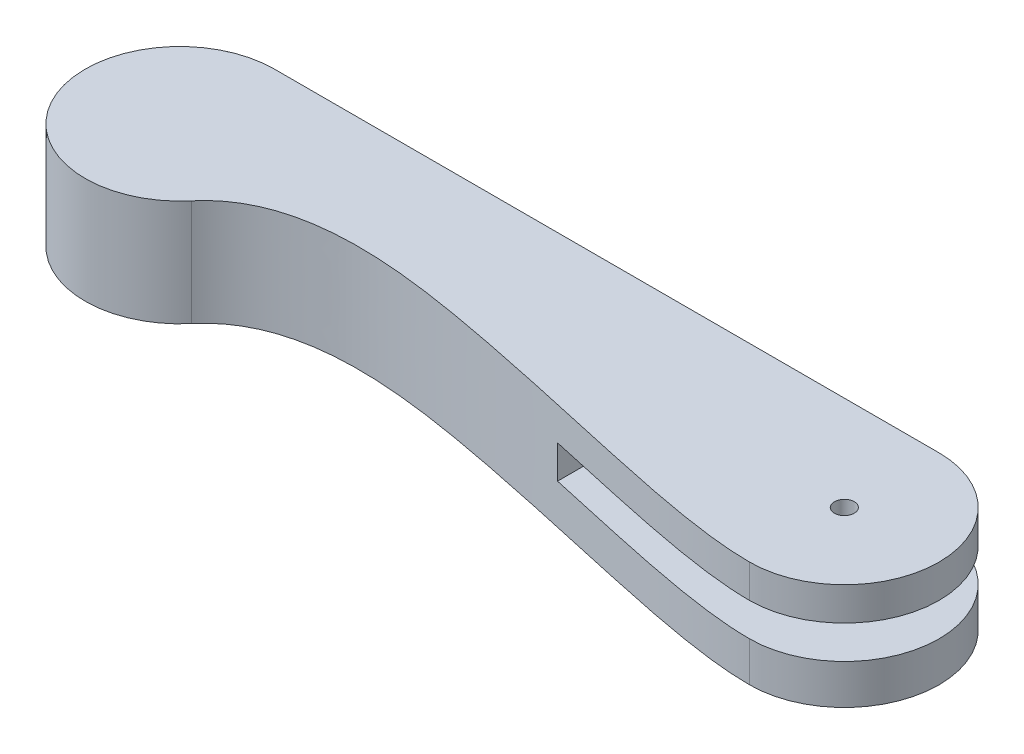
ISO-10303-21;
HEADER;
FILE_DESCRIPTION(('STEP AP214'),'2;1');
FILE_NAME('part.step','',(''),(''),'','','');
FILE_SCHEMA(('AUTOMOTIVE_DESIGN { 1 0 10303 214 1 1 1 1 }'));
ENDSEC;
DATA;
#1=APPLICATION_CONTEXT('core data for automotive mechanical design processes');
#2=APPLICATION_PROTOCOL_DEFINITION('international standard','automotive_design',2000,#1);
#3=PRODUCT_CONTEXT('',#1,'mechanical');
#4=PRODUCT('Part','Part','',(#3));
#5=PRODUCT_RELATED_PRODUCT_CATEGORY('part','',(#4));
#6=PRODUCT_DEFINITION_FORMATION('','',#4);
#7=PRODUCT_DEFINITION_CONTEXT('part definition',#1,'design');
#8=PRODUCT_DEFINITION('design','',#6,#7);
#9=PRODUCT_DEFINITION_SHAPE('','',#8);
#10=(LENGTH_UNIT() NAMED_UNIT(*) SI_UNIT(.MILLI.,.METRE.));
#11=(NAMED_UNIT(*) PLANE_ANGLE_UNIT() SI_UNIT($,.RADIAN.));
#12=(NAMED_UNIT(*) SI_UNIT($,.STERADIAN.) SOLID_ANGLE_UNIT());
#13=UNCERTAINTY_MEASURE_WITH_UNIT(LENGTH_MEASURE(1.E-05),#10,'distance_accuracy_value','');
#14=(GEOMETRIC_REPRESENTATION_CONTEXT(3) GLOBAL_UNCERTAINTY_ASSIGNED_CONTEXT((#13)) GLOBAL_UNIT_ASSIGNED_CONTEXT((#10,
#11,#12)) REPRESENTATION_CONTEXT('',''));
#15=CARTESIAN_POINT('',(0.,0.,0.));
#16=DIRECTION('',(0.,0.,1.));
#17=DIRECTION('',(1.,0.,0.));
#18=AXIS2_PLACEMENT_3D('',#15,#16,#17);
#19=CARTESIAN_POINT('',(-50.,6.,0.));
#20=DIRECTION('',(0.,1.,0.));
#21=DIRECTION('',(0.,0.,1.));
#22=AXIS2_PLACEMENT_3D('',#19,#20,#21);
#23=PLANE('',#22);
#24=CARTESIAN_POINT('',(50.,6.,0.));
#25=DIRECTION('',(0.,-1.,0.));
#26=DIRECTION('',(0.,0.,-1.));
#27=AXIS2_PLACEMENT_3D('',#24,#25,#26);
#28=CIRCLE('',#27,1.5);
#29=CARTESIAN_POINT('',(50.,6.,-1.50000000000002));
#30=VERTEX_POINT('',#29);
#31=EDGE_CURVE('E185',#30,#30,#28,.T.);
#32=ORIENTED_EDGE('',*,*,#31,.T.);
#33=EDGE_LOOP('',(#32));
#34=FACE_BOUND('',#33,.T.);
#35=DIRECTION('',(0.,0.,-1.));
#36=VECTOR('',#35,1.);
#37=CARTESIAN_POINT('',(15.,6.,-14.25));
#38=LINE('',#37,#36);
#39=CARTESIAN_POINT('',(15.,6.,8.15498555520888));
#40=VERTEX_POINT('',#39);
#41=CARTESIAN_POINT('',(15.,6.,-14.25));
#42=VERTEX_POINT('',#41);
#43=EDGE_CURVE('E86',#40,#42,#38,.T.);
#44=ORIENTED_EDGE('',*,*,#43,.F.);
#45=CARTESIAN_POINT('',(-39.0731568300049,6.,9.1469447543063));
#46=CARTESIAN_POINT('',(-31.5140940330976,6.,0.116968525897957));
#47=CARTESIAN_POINT('',(5.43865583696203,6.,4.64524054337758));
#48=CARTESIAN_POINT('',(38.6975143870055,6.,14.25));
#49=CARTESIAN_POINT('',(50.,6.,14.25));
#50=B_SPLINE_CURVE_WITH_KNOTS('',3,(#45,#46,#47,#48,#49),.UNSPECIFIED.,.F.,.F.,(4,1,4),(0.,
0.43590790251524,1.),.UNSPECIFIED.);
#51=CARTESIAN_POINT('',(50.,6.,14.25));
#52=VERTEX_POINT('',#51);
#53=EDGE_CURVE('E206',#52,#40,#50,.F.);
#54=ORIENTED_EDGE('',*,*,#53,.F.);
#55=CARTESIAN_POINT('',(50.,6.,0.));
#56=DIRECTION('',(0.,1.,0.));
#57=DIRECTION('',(0.,0.,1.));
#58=AXIS2_PLACEMENT_3D('',#55,#56,#57);
#59=CIRCLE('',#58,14.25);
#60=CARTESIAN_POINT('',(50.,6.,-14.25));
#61=VERTEX_POINT('',#60);
#62=EDGE_CURVE('E67',#52,#61,#59,.T.);
#63=ORIENTED_EDGE('',*,*,#62,.T.);
#64=DIRECTION('',(-1.,0.,0.));
#65=VECTOR('',#64,1.);
#66=CARTESIAN_POINT('',(-50.,6.,-14.25));
#67=LINE('',#66,#65);
#68=EDGE_CURVE('E148',#61,#42,#67,.T.);
#69=ORIENTED_EDGE('',*,*,#68,.T.);
#70=EDGE_LOOP('',(#44,#54,#63,#69));
#71=FACE_BOUND('',#70,.T.);
#72=ADVANCED_FACE('F41',(#34,#71),#23,.T.);
#73=CARTESIAN_POINT('',(-50.,0.,0.));
#74=DIRECTION('',(0.,1.,0.));
#75=DIRECTION('',(0.,0.,1.));
#76=AXIS2_PLACEMENT_3D('',#73,#74,#75);
#77=PLANE('',#76);
#78=CARTESIAN_POINT('',(-50.,0.,8.25));
#79=DIRECTION('',(0.,1.,0.));
#80=DIRECTION('',(0.,0.,1.));
#81=AXIS2_PLACEMENT_3D('',#78,#79,#80);
#82=CIRCLE('',#81,2.49999999999999);
#83=CARTESIAN_POINT('',(-50.,0.,10.75));
#84=VERTEX_POINT('',#83);
#85=EDGE_CURVE('E188',#84,#84,#82,.F.);
#86=ORIENTED_EDGE('',*,*,#85,.F.);
#87=EDGE_LOOP('',(#86));
#88=FACE_BOUND('',#87,.T.);
#89=CARTESIAN_POINT('',(-49.9999999999999,0.,-8.25));
#90=DIRECTION('',(0.,1.,0.));
#91=DIRECTION('',(0.,0.,1.));
#92=AXIS2_PLACEMENT_3D('',#89,#90,#91);
#93=CIRCLE('',#92,2.49999999999999);
#94=CARTESIAN_POINT('',(-49.9999999999999,0.,-5.75000000000001));
#95=VERTEX_POINT('',#94);
#96=EDGE_CURVE('E141',#95,#95,#93,.F.);
#97=ORIENTED_EDGE('',*,*,#96,.F.);
#98=EDGE_LOOP('',(#97));
#99=FACE_BOUND('',#98,.T.);
#100=CARTESIAN_POINT('',(50.,0.,0.));
#101=DIRECTION('',(0.,-1.,0.));
#102=DIRECTION('',(0.,0.,-1.));
#103=AXIS2_PLACEMENT_3D('',#100,#101,#102);
#104=CIRCLE('',#103,1.5);
#105=CARTESIAN_POINT('',(50.,0.,-1.50000000000002));
#106=VERTEX_POINT('',#105);
#107=EDGE_CURVE('E189',#106,#106,#104,.T.);
#108=ORIENTED_EDGE('',*,*,#107,.F.);
#109=EDGE_LOOP('',(#108));
#110=FACE_BOUND('',#109,.T.);
#111=CARTESIAN_POINT('',(-39.0731568300049,0.,9.1469447543063));
#112=CARTESIAN_POINT('',(-31.5140940330976,0.,0.116968525897957));
#113=CARTESIAN_POINT('',(5.43865583696203,0.,4.64524054337758));
#114=CARTESIAN_POINT('',(38.6975143870055,0.,14.25));
#115=CARTESIAN_POINT('',(50.,0.,14.25));
#116=B_SPLINE_CURVE_WITH_KNOTS('',3,(#111,#112,#113,#114,#115),.UNSPECIFIED.,.F.,.F.,(4,1,4),
(0.,0.43590790251524,1.),.UNSPECIFIED.);
#117=CARTESIAN_POINT('',(50.,0.,14.25));
#118=VERTEX_POINT('',#117);
#119=CARTESIAN_POINT('',(-39.0731568300049,0.,9.14694475430629));
#120=VERTEX_POINT('',#119);
#121=EDGE_CURVE('E126',#118,#120,#116,.F.);
#122=ORIENTED_EDGE('',*,*,#121,.T.);
#123=CARTESIAN_POINT('',(-50.,0.,0.));
#124=DIRECTION('',(0.,1.,0.));
#125=DIRECTION('',(0.,0.,1.));
#126=AXIS2_PLACEMENT_3D('',#123,#124,#125);
#127=CIRCLE('',#126,14.25);
#128=CARTESIAN_POINT('',(-50.,0.,-14.25));
#129=VERTEX_POINT('',#128);
#130=EDGE_CURVE('E138',#129,#120,#127,.T.);
#131=ORIENTED_EDGE('',*,*,#130,.F.);
#132=DIRECTION('',(-1.,0.,0.));
#133=VECTOR('',#132,1.);
#134=CARTESIAN_POINT('',(-50.,0.,-14.25));
#135=LINE('',#134,#133);
#136=CARTESIAN_POINT('',(50.,0.,-14.25));
#137=VERTEX_POINT('',#136);
#138=EDGE_CURVE('E137',#137,#129,#135,.T.);
#139=ORIENTED_EDGE('',*,*,#138,.F.);
#140=CARTESIAN_POINT('',(50.,0.,0.));
#141=DIRECTION('',(0.,1.,0.));
#142=DIRECTION('',(0.,0.,1.));
#143=AXIS2_PLACEMENT_3D('',#140,#141,#142);
#144=CIRCLE('',#143,14.25);
#145=EDGE_CURVE('E78',#118,#137,#144,.T.);
#146=ORIENTED_EDGE('',*,*,#145,.F.);
#147=EDGE_LOOP('',(#122,#131,#139,#146));
#148=FACE_BOUND('',#147,.T.);
#149=ADVANCED_FACE('F136',(#88,#99,#110,#148),#77,.F.);
#150=CARTESIAN_POINT('',(15.,11.,-14.25));
#151=DIRECTION('',(-1.,0.,0.));
#152=DIRECTION('',(0.,0.,1.));
#153=AXIS2_PLACEMENT_3D('',#150,#151,#152);
#154=PLANE('',#153);
#155=DIRECTION('',(0.,1.,0.));
#156=VECTOR('',#155,1.);
#157=CARTESIAN_POINT('',(15.,-0.001000000000001,8.15498555520888));
#158=LINE('',#157,#156);
#159=CARTESIAN_POINT('',(15.0000000058143,11.,8.1549855564899));
#160=VERTEX_POINT('',#159);
#161=EDGE_CURVE('E205',#160,#40,#158,.F.);
#162=ORIENTED_EDGE('',*,*,#161,.T.);
#163=ORIENTED_EDGE('',*,*,#43,.T.);
#164=DIRECTION('',(0.,-1.,0.));
#165=VECTOR('',#164,1.);
#166=CARTESIAN_POINT('',(15.,11.,-14.25));
#167=LINE('',#166,#165);
#168=CARTESIAN_POINT('',(15.,11.,-14.25));
#169=VERTEX_POINT('',#168);
#170=EDGE_CURVE('E180',#169,#42,#167,.T.);
#171=ORIENTED_EDGE('',*,*,#170,.F.);
#172=DIRECTION('',(0.,0.,-1.));
#173=VECTOR('',#172,1.);
#174=CARTESIAN_POINT('',(15.,11.,-14.25));
#175=LINE('',#174,#173);
#176=EDGE_CURVE('E93',#160,#169,#175,.T.);
#177=ORIENTED_EDGE('',*,*,#176,.F.);
#178=EDGE_LOOP('',(#162,#163,#171,#177));
#179=FACE_BOUND('',#178,.T.);
#180=ADVANCED_FACE('F204',(#179),#154,.F.);
#181=CARTESIAN_POINT('',(-50.,11.,0.));
#182=DIRECTION('',(0.,1.,0.));
#183=DIRECTION('',(0.,0.,1.));
#184=AXIS2_PLACEMENT_3D('',#181,#182,#183);
#185=PLANE('',#184);
#186=CARTESIAN_POINT('',(50.,11.,0.));
#187=DIRECTION('',(0.,1.,0.));
#188=DIRECTION('',(0.,0.,1.));
#189=AXIS2_PLACEMENT_3D('',#186,#187,#188);
#190=CIRCLE('',#189,1.5);
#191=CARTESIAN_POINT('',(50.,11.,1.49999999999999));
#192=VERTEX_POINT('',#191);
#193=EDGE_CURVE('E157',#192,#192,#190,.F.);
#194=ORIENTED_EDGE('',*,*,#193,.F.);
#195=EDGE_LOOP('',(#194));
#196=FACE_BOUND('',#195,.T.);
#197=CARTESIAN_POINT('',(-39.0731568300049,11.,9.1469447543063));
#198=CARTESIAN_POINT('',(-31.5140940330976,11.,0.116968525897957));
#199=CARTESIAN_POINT('',(5.43865583696203,11.,4.64524054337758));
#200=CARTESIAN_POINT('',(38.6975143870055,11.,14.25));
#201=CARTESIAN_POINT('',(50.,11.,14.25));
#202=B_SPLINE_CURVE_WITH_KNOTS('',3,(#197,#198,#199,#200,#201),.UNSPECIFIED.,.F.,.F.,(4,1,4),
(0.,0.43590790251524,1.),.UNSPECIFIED.);
#203=CARTESIAN_POINT('',(50.,11.,14.25));
#204=VERTEX_POINT('',#203);
#205=EDGE_CURVE('E132',#204,#160,#202,.F.);
#206=ORIENTED_EDGE('',*,*,#205,.T.);
#207=ORIENTED_EDGE('',*,*,#176,.T.);
#208=DIRECTION('',(-1.,0.,0.));
#209=VECTOR('',#208,1.);
#210=CARTESIAN_POINT('',(-50.,11.,-14.25));
#211=LINE('',#210,#209);
#212=CARTESIAN_POINT('',(50.,11.,-14.25));
#213=VERTEX_POINT('',#212);
#214=EDGE_CURVE('E156',#213,#169,#211,.T.);
#215=ORIENTED_EDGE('',*,*,#214,.F.);
#216=CARTESIAN_POINT('',(50.,11.,0.));
#217=DIRECTION('',(0.,1.,0.));
#218=DIRECTION('',(0.,0.,1.));
#219=AXIS2_PLACEMENT_3D('',#216,#217,#218);
#220=CIRCLE('',#219,14.25);
#221=EDGE_CURVE('E155',#204,#213,#220,.T.);
#222=ORIENTED_EDGE('',*,*,#221,.F.);
#223=EDGE_LOOP('',(#206,#207,#215,#222));
#224=FACE_BOUND('',#223,.T.);
#225=ADVANCED_FACE('F241',(#196,#224),#185,.F.);
#226=CARTESIAN_POINT('',(-50.,16.,0.));
#227=DIRECTION('',(0.,1.,0.));
#228=DIRECTION('',(0.,0.,1.));
#229=AXIS2_PLACEMENT_3D('',#226,#227,#228);
#230=PLANE('',#229);
#231=CARTESIAN_POINT('',(50.,16.,0.));
#232=DIRECTION('',(0.,1.,0.));
#233=DIRECTION('',(0.,0.,1.));
#234=AXIS2_PLACEMENT_3D('',#231,#232,#233);
#235=CIRCLE('',#234,1.5);
#236=CARTESIAN_POINT('',(50.,16.,1.49999999999999));
#237=VERTEX_POINT('',#236);
#238=EDGE_CURVE('E165',#237,#237,#235,.T.);
#239=ORIENTED_EDGE('',*,*,#238,.F.);
#240=EDGE_LOOP('',(#239));
#241=FACE_BOUND('',#240,.T.);
#242=CARTESIAN_POINT('',(-50.,16.,0.));
#243=DIRECTION('',(0.,1.,0.));
#244=DIRECTION('',(0.,0.,1.));
#245=AXIS2_PLACEMENT_3D('',#242,#243,#244);
#246=CIRCLE('',#245,14.25);
#247=CARTESIAN_POINT('',(-50.,16.,-14.25));
#248=VERTEX_POINT('',#247);
#249=CARTESIAN_POINT('',(-39.0731568300049,16.,9.14694475430629));
#250=VERTEX_POINT('',#249);
#251=EDGE_CURVE('E58',#248,#250,#246,.T.);
#252=ORIENTED_EDGE('',*,*,#251,.T.);
#253=CARTESIAN_POINT('',(-39.0731568300049,16.,9.1469447543063));
#254=CARTESIAN_POINT('',(-31.5140940330976,16.,0.116968525897957));
#255=CARTESIAN_POINT('',(5.43865583696203,16.,4.64524054337758));
#256=CARTESIAN_POINT('',(38.6975143870055,16.,14.25));
#257=CARTESIAN_POINT('',(50.,16.,14.25));
#258=B_SPLINE_CURVE_WITH_KNOTS('',3,(#253,#254,#255,#256,#257),.UNSPECIFIED.,.F.,.F.,(4,1,4),
(0.,0.43590790251524,1.),.UNSPECIFIED.);
#259=CARTESIAN_POINT('',(50.,16.,14.25));
#260=VERTEX_POINT('',#259);
#261=EDGE_CURVE('E208',#250,#260,#258,.T.);
#262=ORIENTED_EDGE('',*,*,#261,.T.);
#263=CARTESIAN_POINT('',(50.,16.,0.));
#264=DIRECTION('',(0.,1.,0.));
#265=DIRECTION('',(0.,0.,1.));
#266=AXIS2_PLACEMENT_3D('',#263,#264,#265);
#267=CIRCLE('',#266,14.25);
#268=CARTESIAN_POINT('',(50.,16.,-14.25));
#269=VERTEX_POINT('',#268);
#270=EDGE_CURVE('E174',#260,#269,#267,.T.);
#271=ORIENTED_EDGE('',*,*,#270,.T.);
#272=DIRECTION('',(-1.,0.,0.));
#273=VECTOR('',#272,1.);
#274=CARTESIAN_POINT('',(-50.,16.,-14.25));
#275=LINE('',#274,#273);
#276=EDGE_CURVE('E176',#269,#248,#275,.T.);
#277=ORIENTED_EDGE('',*,*,#276,.T.);
#278=EDGE_LOOP('',(#252,#262,#271,#277));
#279=FACE_BOUND('',#278,.T.);
#280=ADVANCED_FACE('F238',(#241,#279),#230,.T.);
#281=CARTESIAN_POINT('',(-50.,6.,0.));
#282=DIRECTION('',(0.,-1.,0.));
#283=DIRECTION('',(0.,0.,-1.));
#284=AXIS2_PLACEMENT_3D('',#281,#282,#283);
#285=CYLINDRICAL_SURFACE('',#284,14.25);
#286=ORIENTED_EDGE('',*,*,#130,.T.);
#287=DIRECTION('',(0.,1.,0.));
#288=VECTOR('',#287,1.);
#289=CARTESIAN_POINT('',(-39.0731568300049,-0.001000000000001,9.1469447543063));
#290=LINE('',#289,#288);
#291=EDGE_CURVE('E129',#120,#250,#290,.T.);
#292=ORIENTED_EDGE('',*,*,#291,.T.);
#293=ORIENTED_EDGE('',*,*,#251,.F.);
#294=DIRECTION('',(0.,-1.,0.));
#295=VECTOR('',#294,1.);
#296=CARTESIAN_POINT('',(-50.,6.,-14.25));
#297=LINE('',#296,#295);
#298=EDGE_CURVE('E145',#248,#129,#297,.T.);
#299=ORIENTED_EDGE('',*,*,#298,.T.);
#300=EDGE_LOOP('',(#286,#292,#293,#299));
#301=FACE_BOUND('',#300,.T.);
#302=ADVANCED_FACE('F43',(#301),#285,.T.);
#303=CARTESIAN_POINT('',(50.,6.,0.));
#304=DIRECTION('',(0.,-1.,0.));
#305=DIRECTION('',(0.,0.,-1.));
#306=AXIS2_PLACEMENT_3D('',#303,#304,#305);
#307=CYLINDRICAL_SURFACE('',#306,14.25);
#308=ORIENTED_EDGE('',*,*,#145,.T.);
#309=DIRECTION('',(0.,-1.,0.));
#310=VECTOR('',#309,1.);
#311=CARTESIAN_POINT('',(50.,6.,-14.25));
#312=LINE('',#311,#310);
#313=EDGE_CURVE('E50',#61,#137,#312,.T.);
#314=ORIENTED_EDGE('',*,*,#313,.F.);
#315=ORIENTED_EDGE('',*,*,#62,.F.);
#316=DIRECTION('',(0.,-1.,0.));
#317=VECTOR('',#316,1.);
#318=CARTESIAN_POINT('',(50.,6.,14.25));
#319=LINE('',#318,#317);
#320=EDGE_CURVE('E11',#52,#118,#319,.T.);
#321=ORIENTED_EDGE('',*,*,#320,.T.);
#322=EDGE_LOOP('',(#308,#314,#315,#321));
#323=FACE_BOUND('',#322,.T.);
#324=ADVANCED_FACE('F134',(#323),#307,.T.);
#325=CARTESIAN_POINT('',(-50.,6.,-14.25));
#326=DIRECTION('',(0.,0.,1.));
#327=DIRECTION('',(1.,0.,0.));
#328=AXIS2_PLACEMENT_3D('',#325,#326,#327);
#329=PLANE('',#328);
#330=ORIENTED_EDGE('',*,*,#138,.T.);
#331=ORIENTED_EDGE('',*,*,#298,.F.);
#332=ORIENTED_EDGE('',*,*,#276,.F.);
#333=DIRECTION('',(0.,-1.,0.));
#334=VECTOR('',#333,1.);
#335=CARTESIAN_POINT('',(50.,16.,-14.25));
#336=LINE('',#335,#334);
#337=EDGE_CURVE('E153',#269,#213,#336,.T.);
#338=ORIENTED_EDGE('',*,*,#337,.T.);
#339=ORIENTED_EDGE('',*,*,#214,.T.);
#340=ORIENTED_EDGE('',*,*,#170,.T.);
#341=ORIENTED_EDGE('',*,*,#68,.F.);
#342=ORIENTED_EDGE('',*,*,#313,.T.);
#343=EDGE_LOOP('',(#330,#331,#332,#338,#339,#340,#341,#342));
#344=FACE_BOUND('',#343,.T.);
#345=ADVANCED_FACE('F203',(#344),#329,.F.);
#346=CARTESIAN_POINT('',(-50.,-0.00100000000000013,8.25));
#347=DIRECTION('',(0.,1.,0.));
#348=DIRECTION('',(0.,0.,1.));
#349=AXIS2_PLACEMENT_3D('',#346,#347,#348);
#350=CYLINDRICAL_SURFACE('',#349,2.49999999999999);
#351=CARTESIAN_POINT('',(-50.,6.,8.25));
#352=DIRECTION('',(0.,1.,0.));
#353=DIRECTION('',(0.,0.,1.));
#354=AXIS2_PLACEMENT_3D('',#351,#352,#353);
#355=CIRCLE('',#354,2.49999999999999);
#356=CARTESIAN_POINT('',(-50.,6.,10.75));
#357=VERTEX_POINT('',#356);
#358=EDGE_CURVE('E184',#357,#357,#355,.T.);
#359=CARTESIAN_POINT('',(-50.,6.,10.75));
#360=CARTESIAN_POINT('',(-50.,5.9375,10.75));
#361=CARTESIAN_POINT('',(-50.,5.875,10.75));
#362=CARTESIAN_POINT('',(-50.,5.75,10.75));
#363=CARTESIAN_POINT('',(-50.,5.6875,10.75));
#364=CARTESIAN_POINT('',(-50.,5.5625,10.75));
#365=CARTESIAN_POINT('',(-50.,5.5,10.75));
#366=CARTESIAN_POINT('',(-50.,5.375,10.75));
#367=CARTESIAN_POINT('',(-50.,5.3125,10.75));
#368=CARTESIAN_POINT('',(-50.,5.1875,10.75));
#369=CARTESIAN_POINT('',(-50.,5.125,10.75));
#370=CARTESIAN_POINT('',(-50.,5.,10.75));
#371=CARTESIAN_POINT('',(-50.,4.9375,10.75));
#372=CARTESIAN_POINT('',(-50.,4.8125,10.75));
#373=CARTESIAN_POINT('',(-50.,4.75,10.75));
#374=CARTESIAN_POINT('',(-50.,4.625,10.75));
#375=CARTESIAN_POINT('',(-50.,4.5625,10.75));
#376=CARTESIAN_POINT('',(-50.,4.4375,10.75));
#377=CARTESIAN_POINT('',(-50.,4.375,10.75));
#378=CARTESIAN_POINT('',(-50.,4.25,10.75));
#379=CARTESIAN_POINT('',(-50.,4.1875,10.75));
#380=CARTESIAN_POINT('',(-50.,4.0625,10.75));
#381=CARTESIAN_POINT('',(-50.,4.,10.75));
#382=CARTESIAN_POINT('',(-50.,3.875,10.75));
#383=CARTESIAN_POINT('',(-50.,3.8125,10.75));
#384=CARTESIAN_POINT('',(-50.,3.6875,10.75));
#385=CARTESIAN_POINT('',(-50.,3.625,10.75));
#386=CARTESIAN_POINT('',(-50.,3.5,10.75));
#387=CARTESIAN_POINT('',(-50.,3.4375,10.75));
#388=CARTESIAN_POINT('',(-50.,3.3125,10.75));
#389=CARTESIAN_POINT('',(-50.,3.25,10.75));
#390=CARTESIAN_POINT('',(-50.,3.125,10.75));
#391=CARTESIAN_POINT('',(-50.,3.0625,10.75));
#392=CARTESIAN_POINT('',(-50.,2.9375,10.75));
#393=CARTESIAN_POINT('',(-50.,2.875,10.75));
#394=CARTESIAN_POINT('',(-50.,2.75,10.75));
#395=CARTESIAN_POINT('',(-50.,2.6875,10.75));
#396=CARTESIAN_POINT('',(-50.,2.5625,10.75));
#397=CARTESIAN_POINT('',(-50.,2.5,10.75));
#398=CARTESIAN_POINT('',(-50.,2.375,10.75));
#399=CARTESIAN_POINT('',(-50.,2.3125,10.75));
#400=CARTESIAN_POINT('',(-50.,2.1875,10.75));
#401=CARTESIAN_POINT('',(-50.,2.125,10.75));
#402=CARTESIAN_POINT('',(-50.,2.,10.75));
#403=CARTESIAN_POINT('',(-50.,1.9375,10.75));
#404=CARTESIAN_POINT('',(-50.,1.8125,10.75));
#405=CARTESIAN_POINT('',(-50.,1.75,10.75));
#406=CARTESIAN_POINT('',(-50.,1.625,10.75));
#407=CARTESIAN_POINT('',(-50.,1.5625,10.75));
#408=CARTESIAN_POINT('',(-50.,1.4375,10.75));
#409=CARTESIAN_POINT('',(-50.,1.375,10.75));
#410=CARTESIAN_POINT('',(-50.,1.25,10.75));
#411=CARTESIAN_POINT('',(-50.,1.1875,10.75));
#412=CARTESIAN_POINT('',(-50.,1.0625,10.75));
#413=CARTESIAN_POINT('',(-50.,1.,10.75));
#414=CARTESIAN_POINT('',(-50.,0.875,10.75));
#415=CARTESIAN_POINT('',(-50.,0.8125,10.75));
#416=CARTESIAN_POINT('',(-50.,0.6875,10.75));
#417=CARTESIAN_POINT('',(-50.,0.625,10.75));
#418=CARTESIAN_POINT('',(-50.,0.5,10.75));
#419=CARTESIAN_POINT('',(-50.,0.4375,10.75));
#420=CARTESIAN_POINT('',(-50.,0.3125,10.75));
#421=CARTESIAN_POINT('',(-50.,0.25,10.75));
#422=CARTESIAN_POINT('',(-50.,0.125,10.75));
#423=CARTESIAN_POINT('',(-50.,0.0625000000000001,10.75));
#424=CARTESIAN_POINT('',(-50.,0.,10.75));
#425=B_SPLINE_CURVE_WITH_KNOTS('',3,(#359,#360,#361,#362,#363,#364,#365,#366,#367,#368,#369,
#370,#371,#372,#373,#374,#375,#376,#377,#378,#379,#380,#381,#382,#383,#384,#385,#386,#387,#388,
#389,#390,#391,#392,#393,#394,#395,#396,#397,#398,#399,#400,#401,#402,#403,#404,#405,#406,#407,
#408,#409,#410,#411,#412,#413,#414,#415,#416,#417,#418,#419,#420,#421,#422,#423,#424),
.UNSPECIFIED.,.F.,.F.,(4,2,2,2,2,2,2,2,2,2,2,2,2,2,2,2,2,2,2,2,2,2,2,2,2,2,2,2,2,2,2,2,4),(0.,
0.1875,0.375,0.5625,0.75,0.9375,1.125,1.3125,1.5,1.6875,1.875,2.0625,2.25,2.4375,2.625,2.8125,
3.,3.1875,3.375,3.5625,3.75,3.9375,4.125,4.3125,4.5,4.6875,4.875,5.0625,5.25,5.4375,5.625,
5.8125,6.),.UNSPECIFIED.);
#426=EDGE_CURVE('BSEAM262',#357,#84,#425,.T.);
#427=ORIENTED_EDGE('',*,*,#358,.T.);
#428=ORIENTED_EDGE('',*,*,#85,.T.);
#429=ORIENTED_EDGE('',*,*,#426,.T.);
#430=ORIENTED_EDGE('',*,*,#426,.F.);
#431=EDGE_LOOP('',(#427,#429,#428,#430));
#432=FACE_BOUND('',#431,.T.);
#433=ADVANCED_FACE('F262',(#432),#350,.F.);
#434=CARTESIAN_POINT('',(-49.9999999999999,-0.00100000000000013,-8.25));
#435=DIRECTION('',(0.,1.,0.));
#436=DIRECTION('',(0.,0.,1.));
#437=AXIS2_PLACEMENT_3D('',#434,#435,#436);
#438=CYLINDRICAL_SURFACE('',#437,2.49999999999999);
#439=CARTESIAN_POINT('',(-49.9999999999999,6.,-8.25));
#440=DIRECTION('',(0.,1.,0.));
#441=DIRECTION('',(0.,0.,1.));
#442=AXIS2_PLACEMENT_3D('',#439,#440,#441);
#443=CIRCLE('',#442,2.49999999999999);
#444=CARTESIAN_POINT('',(-49.9999999999999,6.,-5.75000000000001));
#445=VERTEX_POINT('',#444);
#446=EDGE_CURVE('E192',#445,#445,#443,.T.);
#447=CARTESIAN_POINT('',(-49.9999999999999,6.,-5.75000000000001));
#448=CARTESIAN_POINT('',(-49.9999999999999,5.9375,-5.75000000000001));
#449=CARTESIAN_POINT('',(-49.9999999999999,5.875,-5.75000000000001));
#450=CARTESIAN_POINT('',(-49.9999999999999,5.75,-5.75000000000001));
#451=CARTESIAN_POINT('',(-49.9999999999999,5.6875,-5.75000000000001));
#452=CARTESIAN_POINT('',(-49.9999999999999,5.5625,-5.75000000000001));
#453=CARTESIAN_POINT('',(-49.9999999999999,5.5,-5.75000000000001));
#454=CARTESIAN_POINT('',(-49.9999999999999,5.375,-5.75000000000001));
#455=CARTESIAN_POINT('',(-49.9999999999999,5.3125,-5.75000000000001));
#456=CARTESIAN_POINT('',(-49.9999999999999,5.1875,-5.75000000000001));
#457=CARTESIAN_POINT('',(-49.9999999999999,5.125,-5.75000000000001));
#458=CARTESIAN_POINT('',(-49.9999999999999,5.,-5.75000000000001));
#459=CARTESIAN_POINT('',(-49.9999999999999,4.9375,-5.75000000000001));
#460=CARTESIAN_POINT('',(-49.9999999999999,4.8125,-5.75000000000001));
#461=CARTESIAN_POINT('',(-49.9999999999999,4.75,-5.75000000000001));
#462=CARTESIAN_POINT('',(-49.9999999999999,4.625,-5.75000000000001));
#463=CARTESIAN_POINT('',(-49.9999999999999,4.5625,-5.75000000000001));
#464=CARTESIAN_POINT('',(-49.9999999999999,4.4375,-5.75000000000001));
#465=CARTESIAN_POINT('',(-49.9999999999999,4.375,-5.75000000000001));
#466=CARTESIAN_POINT('',(-49.9999999999999,4.25,-5.75000000000001));
#467=CARTESIAN_POINT('',(-49.9999999999999,4.1875,-5.75000000000001));
#468=CARTESIAN_POINT('',(-49.9999999999999,4.0625,-5.75000000000001));
#469=CARTESIAN_POINT('',(-49.9999999999999,4.,-5.75000000000001));
#470=CARTESIAN_POINT('',(-49.9999999999999,3.875,-5.75000000000001));
#471=CARTESIAN_POINT('',(-49.9999999999999,3.8125,-5.75000000000001));
#472=CARTESIAN_POINT('',(-49.9999999999999,3.6875,-5.75000000000001));
#473=CARTESIAN_POINT('',(-49.9999999999999,3.625,-5.75000000000001));
#474=CARTESIAN_POINT('',(-49.9999999999999,3.5,-5.75000000000001));
#475=CARTESIAN_POINT('',(-49.9999999999999,3.4375,-5.75000000000001));
#476=CARTESIAN_POINT('',(-49.9999999999999,3.3125,-5.75000000000001));
#477=CARTESIAN_POINT('',(-49.9999999999999,3.25,-5.75000000000001));
#478=CARTESIAN_POINT('',(-49.9999999999999,3.125,-5.75000000000001));
#479=CARTESIAN_POINT('',(-49.9999999999999,3.0625,-5.75000000000001));
#480=CARTESIAN_POINT('',(-49.9999999999999,2.9375,-5.75000000000001));
#481=CARTESIAN_POINT('',(-49.9999999999999,2.875,-5.75000000000001));
#482=CARTESIAN_POINT('',(-49.9999999999999,2.75,-5.75000000000001));
#483=CARTESIAN_POINT('',(-49.9999999999999,2.6875,-5.75000000000001));
#484=CARTESIAN_POINT('',(-49.9999999999999,2.5625,-5.75000000000001));
#485=CARTESIAN_POINT('',(-49.9999999999999,2.5,-5.75000000000001));
#486=CARTESIAN_POINT('',(-49.9999999999999,2.375,-5.75000000000001));
#487=CARTESIAN_POINT('',(-49.9999999999999,2.3125,-5.75000000000001));
#488=CARTESIAN_POINT('',(-49.9999999999999,2.1875,-5.75000000000001));
#489=CARTESIAN_POINT('',(-49.9999999999999,2.125,-5.75000000000001));
#490=CARTESIAN_POINT('',(-49.9999999999999,2.,-5.75000000000001));
#491=CARTESIAN_POINT('',(-49.9999999999999,1.9375,-5.75000000000001));
#492=CARTESIAN_POINT('',(-49.9999999999999,1.8125,-5.75000000000001));
#493=CARTESIAN_POINT('',(-49.9999999999999,1.75,-5.75000000000001));
#494=CARTESIAN_POINT('',(-49.9999999999999,1.625,-5.75000000000001));
#495=CARTESIAN_POINT('',(-49.9999999999999,1.5625,-5.75000000000001));
#496=CARTESIAN_POINT('',(-49.9999999999999,1.4375,-5.75000000000001));
#497=CARTESIAN_POINT('',(-49.9999999999999,1.375,-5.75000000000001));
#498=CARTESIAN_POINT('',(-49.9999999999999,1.25,-5.75000000000001));
#499=CARTESIAN_POINT('',(-49.9999999999999,1.1875,-5.75000000000001));
#500=CARTESIAN_POINT('',(-49.9999999999999,1.0625,-5.75000000000001));
#501=CARTESIAN_POINT('',(-49.9999999999999,1.,-5.75000000000001));
#502=CARTESIAN_POINT('',(-49.9999999999999,0.875,-5.75000000000001));
#503=CARTESIAN_POINT('',(-49.9999999999999,0.8125,-5.75000000000001));
#504=CARTESIAN_POINT('',(-49.9999999999999,0.6875,-5.75000000000001));
#505=CARTESIAN_POINT('',(-49.9999999999999,0.625,-5.75000000000001));
#506=CARTESIAN_POINT('',(-49.9999999999999,0.5,-5.75000000000001));
#507=CARTESIAN_POINT('',(-49.9999999999999,0.4375,-5.75000000000001));
#508=CARTESIAN_POINT('',(-49.9999999999999,0.3125,-5.75000000000001));
#509=CARTESIAN_POINT('',(-49.9999999999999,0.25,-5.75000000000001));
#510=CARTESIAN_POINT('',(-49.9999999999999,0.125,-5.75000000000001));
#511=CARTESIAN_POINT('',(-49.9999999999999,0.0625000000000001,-5.75000000000001));
#512=CARTESIAN_POINT('',(-49.9999999999999,0.,-5.75000000000001));
#513=B_SPLINE_CURVE_WITH_KNOTS('',3,(#447,#448,#449,#450,#451,#452,#453,#454,#455,#456,#457,
#458,#459,#460,#461,#462,#463,#464,#465,#466,#467,#468,#469,#470,#471,#472,#473,#474,#475,#476,
#477,#478,#479,#480,#481,#482,#483,#484,#485,#486,#487,#488,#489,#490,#491,#492,#493,#494,#495,
#496,#497,#498,#499,#500,#501,#502,#503,#504,#505,#506,#507,#508,#509,#510,#511,#512),
.UNSPECIFIED.,.F.,.F.,(4,2,2,2,2,2,2,2,2,2,2,2,2,2,2,2,2,2,2,2,2,2,2,2,2,2,2,2,2,2,2,2,4),(0.,
0.1875,0.375,0.5625,0.75,0.9375,1.125,1.3125,1.5,1.6875,1.875,2.0625,2.25,2.4375,2.625,2.8125,
3.,3.1875,3.375,3.5625,3.75,3.9375,4.125,4.3125,4.5,4.6875,4.875,5.0625,5.25,5.4375,5.625,
5.8125,6.),.UNSPECIFIED.);
#514=EDGE_CURVE('BSEAM258',#445,#95,#513,.T.);
#515=ORIENTED_EDGE('',*,*,#446,.T.);
#516=ORIENTED_EDGE('',*,*,#96,.T.);
#517=ORIENTED_EDGE('',*,*,#514,.T.);
#518=ORIENTED_EDGE('',*,*,#514,.F.);
#519=EDGE_LOOP('',(#515,#517,#516,#518));
#520=FACE_BOUND('',#519,.T.);
#521=ADVANCED_FACE('F258',(#520),#438,.F.);
#522=CARTESIAN_POINT('',(50.,6.,0.));
#523=DIRECTION('',(0.,-1.,0.));
#524=DIRECTION('',(0.,0.,-1.));
#525=AXIS2_PLACEMENT_3D('',#522,#523,#524);
#526=CYLINDRICAL_SURFACE('',#525,1.5);
#527=ORIENTED_EDGE('',*,*,#31,.F.);
#528=EDGE_LOOP('',(#527));
#529=FACE_BOUND('',#528,.T.);
#530=ORIENTED_EDGE('',*,*,#107,.T.);
#531=EDGE_LOOP('',(#530));
#532=FACE_BOUND('',#531,.T.);
#533=ADVANCED_FACE('F252',(#529,#532),#526,.F.);
#534=CARTESIAN_POINT('',(-50.,6.,0.));
#535=DIRECTION('',(0.,1.,0.));
#536=DIRECTION('',(0.,0.,1.));
#537=AXIS2_PLACEMENT_3D('',#534,#535,#536);
#538=PLANE('',#537);
#539=ORIENTED_EDGE('',*,*,#358,.F.);
#540=EDGE_LOOP('',(#539));
#541=FACE_BOUND('',#540,.T.);
#542=ADVANCED_FACE('F249',(#541),#538,.F.);
#543=ORIENTED_EDGE('',*,*,#446,.F.);
#544=EDGE_LOOP('',(#543));
#545=FACE_BOUND('',#544,.T.);
#546=ADVANCED_FACE('F248',(#545),#538,.F.);
#547=CARTESIAN_POINT('',(50.,16.,0.));
#548=DIRECTION('',(0.,-1.,0.));
#549=DIRECTION('',(0.,0.,-1.));
#550=AXIS2_PLACEMENT_3D('',#547,#548,#549);
#551=CYLINDRICAL_SURFACE('',#550,14.25);
#552=ORIENTED_EDGE('',*,*,#221,.T.);
#553=ORIENTED_EDGE('',*,*,#337,.F.);
#554=ORIENTED_EDGE('',*,*,#270,.F.);
#555=DIRECTION('',(0.,-1.,0.));
#556=VECTOR('',#555,1.);
#557=CARTESIAN_POINT('',(50.,16.,14.25));
#558=LINE('',#557,#556);
#559=EDGE_CURVE('E150',#260,#204,#558,.T.);
#560=ORIENTED_EDGE('',*,*,#559,.T.);
#561=EDGE_LOOP('',(#552,#553,#554,#560));
#562=FACE_BOUND('',#561,.T.);
#563=ADVANCED_FACE('F236',(#562),#551,.T.);
#564=CARTESIAN_POINT('',(50.,-0.001000000000001,0.));
#565=DIRECTION('',(0.,1.,0.));
#566=DIRECTION('',(0.,0.,1.));
#567=AXIS2_PLACEMENT_3D('',#564,#565,#566);
#568=CYLINDRICAL_SURFACE('',#567,1.5);
#569=ORIENTED_EDGE('',*,*,#238,.T.);
#570=EDGE_LOOP('',(#569));
#571=FACE_BOUND('',#570,.T.);
#572=ORIENTED_EDGE('',*,*,#193,.T.);
#573=EDGE_LOOP('',(#572));
#574=FACE_BOUND('',#573,.T.);
#575=ADVANCED_FACE('F233',(#571,#574),#568,.F.);
#576=CARTESIAN_POINT('',(-39.0731568300049,-0.001000000000001,9.1469447543063));
#577=CARTESIAN_POINT('',(-31.5140940330976,-0.001000000000001,0.116968525897957));
#578=CARTESIAN_POINT('',(5.43865583696203,-0.001000000000001,4.64524054337758));
#579=CARTESIAN_POINT('',(38.6975143870055,-0.001000000000001,14.25));
#580=CARTESIAN_POINT('',(50.,-0.001000000000001,14.25));
#581=B_SPLINE_CURVE_WITH_KNOTS('',3,(#576,#577,#578,#579,#580),.UNSPECIFIED.,.F.,.F.,(4,1,4),
(0.,0.43590790251524,1.),.UNSPECIFIED.);
#582=DIRECTION('',(0.,1.,0.));
#583=VECTOR('',#582,1.);
#584=SURFACE_OF_LINEAR_EXTRUSION('',#581,#583);
#585=ORIENTED_EDGE('',*,*,#320,.F.);
#586=ORIENTED_EDGE('',*,*,#53,.T.);
#587=ORIENTED_EDGE('',*,*,#161,.F.);
#588=ORIENTED_EDGE('',*,*,#205,.F.);
#589=ORIENTED_EDGE('',*,*,#559,.F.);
#590=ORIENTED_EDGE('',*,*,#261,.F.);
#591=ORIENTED_EDGE('',*,*,#291,.F.);
#592=ORIENTED_EDGE('',*,*,#121,.F.);
#593=EDGE_LOOP('',(#585,#586,#587,#588,#589,#590,#591,#592));
#594=FACE_BOUND('',#593,.T.);
#595=ADVANCED_FACE('F127',(#594),#584,.T.);
#596=CLOSED_SHELL('',(#72,#149,#180,#225,#280,#302,#324,#345,#433,#521,#533,#542,#546,#563,#575,#595));
#597=MANIFOLD_SOLID_BREP('B2',#596);
#598=ADVANCED_BREP_SHAPE_REPRESENTATION('',(#18,#597),#14);
#599=SHAPE_DEFINITION_REPRESENTATION(#9,#598);
ENDSEC;
END-ISO-10303-21;
